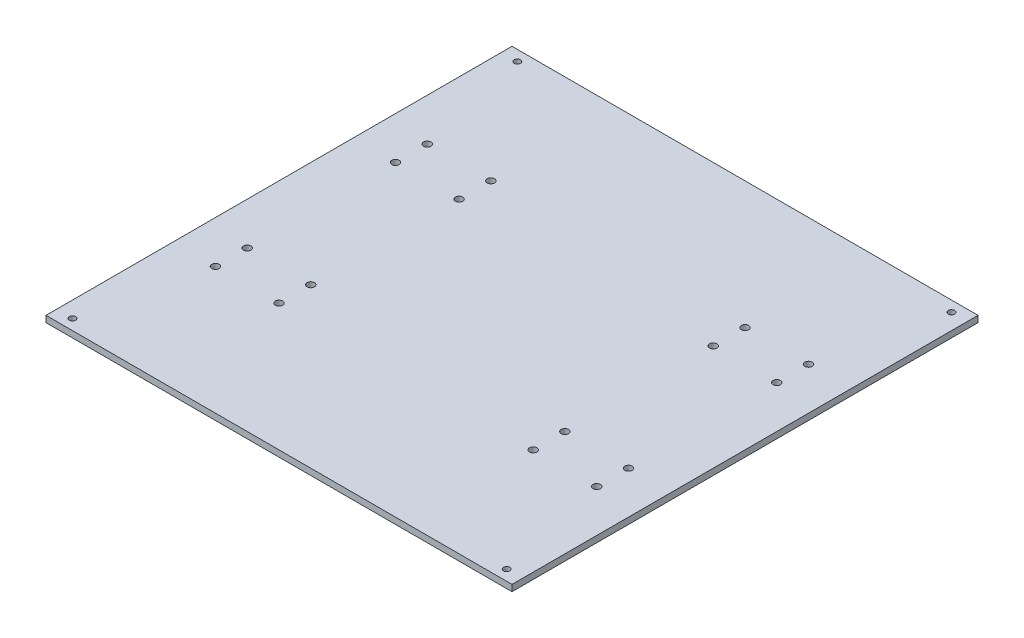
ISO-10303-21;
HEADER;
FILE_DESCRIPTION(('STEP AP214'),'2;1');
FILE_NAME('part.step','',(''),(''),'','','');
FILE_SCHEMA(('AUTOMOTIVE_DESIGN { 1 0 10303 214 1 1 1 1 }'));
ENDSEC;
DATA;
#1=APPLICATION_CONTEXT('core data for automotive mechanical design processes');
#2=APPLICATION_PROTOCOL_DEFINITION('international standard','automotive_design',2000,#1);
#3=PRODUCT_CONTEXT('',#1,'mechanical');
#4=PRODUCT('Part','Part','',(#3));
#5=PRODUCT_RELATED_PRODUCT_CATEGORY('part','',(#4));
#6=PRODUCT_DEFINITION_FORMATION('','',#4);
#7=PRODUCT_DEFINITION_CONTEXT('part definition',#1,'design');
#8=PRODUCT_DEFINITION('design','',#6,#7);
#9=PRODUCT_DEFINITION_SHAPE('','',#8);
#10=(LENGTH_UNIT() NAMED_UNIT(*) SI_UNIT(.MILLI.,.METRE.));
#11=(NAMED_UNIT(*) PLANE_ANGLE_UNIT() SI_UNIT($,.RADIAN.));
#12=(NAMED_UNIT(*) SI_UNIT($,.STERADIAN.) SOLID_ANGLE_UNIT());
#13=UNCERTAINTY_MEASURE_WITH_UNIT(LENGTH_MEASURE(1.E-05),#10,'distance_accuracy_value','');
#14=(GEOMETRIC_REPRESENTATION_CONTEXT(3) GLOBAL_UNCERTAINTY_ASSIGNED_CONTEXT((#13)) GLOBAL_UNIT_ASSIGNED_CONTEXT((#10,
#11,#12)) REPRESENTATION_CONTEXT('',''));
#15=CARTESIAN_POINT('',(0.,0.,0.));
#16=DIRECTION('',(0.,0.,1.));
#17=DIRECTION('',(1.,0.,0.));
#18=AXIS2_PLACEMENT_3D('',#15,#16,#17);
#19=CARTESIAN_POINT('',(0.,3.,0.));
#20=DIRECTION('',(0.,-1.,0.));
#21=DIRECTION('',(0.,0.,-1.));
#22=AXIS2_PLACEMENT_3D('',#19,#20,#21);
#23=PLANE('',#22);
#24=DIRECTION('',(0.,0.,-1.));
#25=VECTOR('',#24,1.);
#26=CARTESIAN_POINT('',(110.,3.,110.));
#27=LINE('',#26,#25);
#28=CARTESIAN_POINT('',(110.,3.,110.));
#29=VERTEX_POINT('',#28);
#30=CARTESIAN_POINT('',(110.,3.,-110.));
#31=VERTEX_POINT('',#30);
#32=EDGE_CURVE('E85',#29,#31,#27,.T.);
#33=ORIENTED_EDGE('',*,*,#32,.T.);
#34=DIRECTION('',(-1.,0.,0.));
#35=VECTOR('',#34,1.);
#36=CARTESIAN_POINT('',(-110.,3.,-110.));
#37=LINE('',#36,#35);
#38=CARTESIAN_POINT('',(-110.,3.,-110.));
#39=VERTEX_POINT('',#38);
#40=EDGE_CURVE('E80',#31,#39,#37,.T.);
#41=ORIENTED_EDGE('',*,*,#40,.T.);
#42=DIRECTION('',(0.,0.,1.));
#43=VECTOR('',#42,1.);
#44=CARTESIAN_POINT('',(-110.,3.,110.));
#45=LINE('',#44,#43);
#46=CARTESIAN_POINT('',(-110.,3.,110.));
#47=VERTEX_POINT('',#46);
#48=EDGE_CURVE('E83',#39,#47,#45,.T.);
#49=ORIENTED_EDGE('',*,*,#48,.T.);
#50=DIRECTION('',(1.,0.,0.));
#51=VECTOR('',#50,1.);
#52=CARTESIAN_POINT('',(-110.,3.,110.));
#53=LINE('',#52,#51);
#54=EDGE_CURVE('E50',#47,#29,#53,.T.);
#55=ORIENTED_EDGE('',*,*,#54,.T.);
#56=EDGE_LOOP('',(#33,#41,#49,#55));
#57=FACE_BOUND('',#56,.T.);
#58=CARTESIAN_POINT('',(-102.5,3.,-105.));
#59=DIRECTION('',(0.,1.,0.));
#60=DIRECTION('',(0.,0.,1.));
#61=AXIS2_PLACEMENT_3D('',#58,#59,#60);
#62=CIRCLE('',#61,1.5);
#63=CARTESIAN_POINT('',(-102.5,3.,-103.5));
#64=VERTEX_POINT('',#63);
#65=EDGE_CURVE('E100',#64,#64,#62,.T.);
#66=ORIENTED_EDGE('',*,*,#65,.F.);
#67=EDGE_LOOP('',(#66));
#68=FACE_BOUND('',#67,.T.);
#69=CARTESIAN_POINT('',(-102.5,3.,105.));
#70=DIRECTION('',(0.,1.,0.));
#71=DIRECTION('',(0.,0.,1.));
#72=AXIS2_PLACEMENT_3D('',#69,#70,#71);
#73=CIRCLE('',#72,1.5);
#74=CARTESIAN_POINT('',(-102.5,3.,106.5));
#75=VERTEX_POINT('',#74);
#76=EDGE_CURVE('E115',#75,#75,#73,.T.);
#77=ORIENTED_EDGE('',*,*,#76,.F.);
#78=EDGE_LOOP('',(#77));
#79=FACE_BOUND('',#78,.T.);
#80=CARTESIAN_POINT('',(102.5,3.,105.));
#81=DIRECTION('',(0.,1.,0.));
#82=DIRECTION('',(0.,0.,-1.));
#83=AXIS2_PLACEMENT_3D('',#80,#81,#82);
#84=CIRCLE('',#83,1.5);
#85=CARTESIAN_POINT('',(102.5,3.,103.5));
#86=VERTEX_POINT('',#85);
#87=EDGE_CURVE('E121',#86,#86,#84,.T.);
#88=ORIENTED_EDGE('',*,*,#87,.F.);
#89=EDGE_LOOP('',(#88));
#90=FACE_BOUND('',#89,.T.);
#91=CARTESIAN_POINT('',(102.5,3.,-105.));
#92=DIRECTION('',(0.,1.,0.));
#93=DIRECTION('',(0.,0.,-1.));
#94=AXIS2_PLACEMENT_3D('',#91,#92,#93);
#95=CIRCLE('',#94,1.5);
#96=CARTESIAN_POINT('',(102.5,3.,-106.5));
#97=VERTEX_POINT('',#96);
#98=EDGE_CURVE('E127',#97,#97,#95,.T.);
#99=ORIENTED_EDGE('',*,*,#98,.F.);
#100=EDGE_LOOP('',(#99));
#101=FACE_BOUND('',#100,.T.);
#102=CARTESIAN_POINT('',(-90.,3.,-50.));
#103=DIRECTION('',(0.,1.,0.));
#104=DIRECTION('',(0.,0.,1.));
#105=AXIS2_PLACEMENT_3D('',#102,#103,#104);
#106=CIRCLE('',#105,1.75);
#107=CARTESIAN_POINT('',(-90.,3.,-48.25));
#108=VERTEX_POINT('',#107);
#109=EDGE_CURVE('E133',#108,#108,#106,.T.);
#110=ORIENTED_EDGE('',*,*,#109,.F.);
#111=EDGE_LOOP('',(#110));
#112=FACE_BOUND('',#111,.T.);
#113=CARTESIAN_POINT('',(-59.9999999999999,3.,-35.));
#114=DIRECTION('',(0.,1.,0.));
#115=DIRECTION('',(0.,0.,1.));
#116=AXIS2_PLACEMENT_3D('',#113,#114,#115);
#117=CIRCLE('',#116,1.75);
#118=CARTESIAN_POINT('',(-59.9999999999999,3.,-33.25));
#119=VERTEX_POINT('',#118);
#120=EDGE_CURVE('E139',#119,#119,#117,.T.);
#121=ORIENTED_EDGE('',*,*,#120,.F.);
#122=EDGE_LOOP('',(#121));
#123=FACE_BOUND('',#122,.T.);
#124=CARTESIAN_POINT('',(-90.,3.,-35.));
#125=DIRECTION('',(0.,1.,0.));
#126=DIRECTION('',(0.,0.,1.));
#127=AXIS2_PLACEMENT_3D('',#124,#125,#126);
#128=CIRCLE('',#127,1.75);
#129=CARTESIAN_POINT('',(-90.,3.,-33.25));
#130=VERTEX_POINT('',#129);
#131=EDGE_CURVE('E145',#130,#130,#128,.T.);
#132=ORIENTED_EDGE('',*,*,#131,.F.);
#133=EDGE_LOOP('',(#132));
#134=FACE_BOUND('',#133,.T.);
#135=CARTESIAN_POINT('',(-60.,3.,-50.));
#136=DIRECTION('',(0.,1.,0.));
#137=DIRECTION('',(0.,0.,1.));
#138=AXIS2_PLACEMENT_3D('',#135,#136,#137);
#139=CIRCLE('',#138,1.75);
#140=CARTESIAN_POINT('',(-60.,3.,-48.25));
#141=VERTEX_POINT('',#140);
#142=EDGE_CURVE('E151',#141,#141,#139,.T.);
#143=ORIENTED_EDGE('',*,*,#142,.F.);
#144=EDGE_LOOP('',(#143));
#145=FACE_BOUND('',#144,.T.);
#146=CARTESIAN_POINT('',(60.,3.,-50.));
#147=DIRECTION('',(0.,1.,0.));
#148=DIRECTION('',(0.,0.,-1.));
#149=AXIS2_PLACEMENT_3D('',#146,#147,#148);
#150=CIRCLE('',#149,1.75);
#151=CARTESIAN_POINT('',(60.,3.,-51.75));
#152=VERTEX_POINT('',#151);
#153=EDGE_CURVE('E157',#152,#152,#150,.T.);
#154=ORIENTED_EDGE('',*,*,#153,.F.);
#155=EDGE_LOOP('',(#154));
#156=FACE_BOUND('',#155,.T.);
#157=CARTESIAN_POINT('',(90.0000000000001,3.,-35.));
#158=DIRECTION('',(0.,1.,0.));
#159=DIRECTION('',(0.,0.,-1.));
#160=AXIS2_PLACEMENT_3D('',#157,#158,#159);
#161=CIRCLE('',#160,1.75);
#162=CARTESIAN_POINT('',(90.0000000000001,3.,-36.75));
#163=VERTEX_POINT('',#162);
#164=EDGE_CURVE('E163',#163,#163,#161,.T.);
#165=ORIENTED_EDGE('',*,*,#164,.F.);
#166=EDGE_LOOP('',(#165));
#167=FACE_BOUND('',#166,.T.);
#168=CARTESIAN_POINT('',(59.9999999999999,3.,-35.));
#169=DIRECTION('',(0.,1.,0.));
#170=DIRECTION('',(0.,0.,-1.));
#171=AXIS2_PLACEMENT_3D('',#168,#169,#170);
#172=CIRCLE('',#171,1.75);
#173=CARTESIAN_POINT('',(59.9999999999999,3.,-36.75));
#174=VERTEX_POINT('',#173);
#175=EDGE_CURVE('E169',#174,#174,#172,.T.);
#176=ORIENTED_EDGE('',*,*,#175,.F.);
#177=EDGE_LOOP('',(#176));
#178=FACE_BOUND('',#177,.T.);
#179=CARTESIAN_POINT('',(90.,3.,-50.));
#180=DIRECTION('',(0.,1.,0.));
#181=DIRECTION('',(0.,0.,-1.));
#182=AXIS2_PLACEMENT_3D('',#179,#180,#181);
#183=CIRCLE('',#182,1.75);
#184=CARTESIAN_POINT('',(90.,3.,-51.75));
#185=VERTEX_POINT('',#184);
#186=EDGE_CURVE('E175',#185,#185,#183,.T.);
#187=ORIENTED_EDGE('',*,*,#186,.F.);
#188=EDGE_LOOP('',(#187));
#189=FACE_BOUND('',#188,.T.);
#190=CARTESIAN_POINT('',(90.,3.,50.));
#191=DIRECTION('',(0.,1.,0.));
#192=DIRECTION('',(0.,0.,1.));
#193=AXIS2_PLACEMENT_3D('',#190,#191,#192);
#194=CIRCLE('',#193,1.75);
#195=CARTESIAN_POINT('',(90.,3.,51.75));
#196=VERTEX_POINT('',#195);
#197=EDGE_CURVE('E181',#196,#196,#194,.T.);
#198=ORIENTED_EDGE('',*,*,#197,.F.);
#199=EDGE_LOOP('',(#198));
#200=FACE_BOUND('',#199,.T.);
#201=CARTESIAN_POINT('',(59.9999999999999,3.,35.));
#202=DIRECTION('',(0.,1.,0.));
#203=DIRECTION('',(0.,0.,1.));
#204=AXIS2_PLACEMENT_3D('',#201,#202,#203);
#205=CIRCLE('',#204,1.75);
#206=CARTESIAN_POINT('',(59.9999999999999,3.,36.75));
#207=VERTEX_POINT('',#206);
#208=EDGE_CURVE('E187',#207,#207,#205,.T.);
#209=ORIENTED_EDGE('',*,*,#208,.F.);
#210=EDGE_LOOP('',(#209));
#211=FACE_BOUND('',#210,.T.);
#212=CARTESIAN_POINT('',(90.0000000000001,3.,35.));
#213=DIRECTION('',(0.,1.,0.));
#214=DIRECTION('',(0.,0.,1.));
#215=AXIS2_PLACEMENT_3D('',#212,#213,#214);
#216=CIRCLE('',#215,1.75);
#217=CARTESIAN_POINT('',(90.0000000000001,3.,36.75));
#218=VERTEX_POINT('',#217);
#219=EDGE_CURVE('E193',#218,#218,#216,.T.);
#220=ORIENTED_EDGE('',*,*,#219,.F.);
#221=EDGE_LOOP('',(#220));
#222=FACE_BOUND('',#221,.T.);
#223=CARTESIAN_POINT('',(60.,3.,50.));
#224=DIRECTION('',(0.,1.,0.));
#225=DIRECTION('',(0.,0.,1.));
#226=AXIS2_PLACEMENT_3D('',#223,#224,#225);
#227=CIRCLE('',#226,1.75);
#228=CARTESIAN_POINT('',(60.,3.,51.75));
#229=VERTEX_POINT('',#228);
#230=EDGE_CURVE('E199',#229,#229,#227,.T.);
#231=ORIENTED_EDGE('',*,*,#230,.F.);
#232=EDGE_LOOP('',(#231));
#233=FACE_BOUND('',#232,.T.);
#234=CARTESIAN_POINT('',(-60.,3.,50.0000000000001));
#235=DIRECTION('',(0.,1.,0.));
#236=DIRECTION('',(0.,0.,-1.));
#237=AXIS2_PLACEMENT_3D('',#234,#235,#236);
#238=CIRCLE('',#237,1.75);
#239=CARTESIAN_POINT('',(-60.,3.,48.2500000000001));
#240=VERTEX_POINT('',#239);
#241=EDGE_CURVE('E205',#240,#240,#238,.T.);
#242=ORIENTED_EDGE('',*,*,#241,.F.);
#243=EDGE_LOOP('',(#242));
#244=FACE_BOUND('',#243,.T.);
#245=CARTESIAN_POINT('',(-90.,3.,35.0000000000001));
#246=DIRECTION('',(0.,1.,0.));
#247=DIRECTION('',(0.,0.,-1.));
#248=AXIS2_PLACEMENT_3D('',#245,#246,#247);
#249=CIRCLE('',#248,1.75);
#250=CARTESIAN_POINT('',(-90.,3.,33.2500000000001));
#251=VERTEX_POINT('',#250);
#252=EDGE_CURVE('E211',#251,#251,#249,.T.);
#253=ORIENTED_EDGE('',*,*,#252,.F.);
#254=EDGE_LOOP('',(#253));
#255=FACE_BOUND('',#254,.T.);
#256=CARTESIAN_POINT('',(-59.9999999999999,3.,35.));
#257=DIRECTION('',(0.,1.,0.));
#258=DIRECTION('',(0.,0.,-1.));
#259=AXIS2_PLACEMENT_3D('',#256,#257,#258);
#260=CIRCLE('',#259,1.75);
#261=CARTESIAN_POINT('',(-59.9999999999999,3.,33.25));
#262=VERTEX_POINT('',#261);
#263=EDGE_CURVE('E217',#262,#262,#260,.T.);
#264=ORIENTED_EDGE('',*,*,#263,.F.);
#265=EDGE_LOOP('',(#264));
#266=FACE_BOUND('',#265,.T.);
#267=CARTESIAN_POINT('',(-90.,3.,49.9999999999999));
#268=DIRECTION('',(0.,1.,0.));
#269=DIRECTION('',(0.,0.,-1.));
#270=AXIS2_PLACEMENT_3D('',#267,#268,#269);
#271=CIRCLE('',#270,1.75);
#272=CARTESIAN_POINT('',(-90.,3.,48.2499999999999));
#273=VERTEX_POINT('',#272);
#274=EDGE_CURVE('E223',#273,#273,#271,.T.);
#275=ORIENTED_EDGE('',*,*,#274,.F.);
#276=EDGE_LOOP('',(#275));
#277=FACE_BOUND('',#276,.T.);
#278=ADVANCED_FACE('F33',(#57,#68,#79,#90,#101,#112,#123,#134,#145,#156,#167,#178,#189,#200,
#211,#222,#233,#244,#255,#266,#277),#23,.F.);
#279=CARTESIAN_POINT('',(0.,0.,0.));
#280=DIRECTION('',(0.,-1.,0.));
#281=DIRECTION('',(0.,0.,-1.));
#282=AXIS2_PLACEMENT_3D('',#279,#280,#281);
#283=PLANE('',#282);
#284=CARTESIAN_POINT('',(-59.9999999999999,0.,35.));
#285=DIRECTION('',(0.,1.,0.));
#286=DIRECTION('',(0.,0.,-1.));
#287=AXIS2_PLACEMENT_3D('',#284,#285,#286);
#288=CIRCLE('',#287,1.75);
#289=CARTESIAN_POINT('',(-59.9999999999999,0.,33.25));
#290=VERTEX_POINT('',#289);
#291=EDGE_CURVE('E220',#290,#290,#288,.T.);
#292=ORIENTED_EDGE('',*,*,#291,.T.);
#293=EDGE_LOOP('',(#292));
#294=FACE_BOUND('',#293,.T.);
#295=CARTESIAN_POINT('',(-60.,0.,50.0000000000001));
#296=DIRECTION('',(0.,1.,0.));
#297=DIRECTION('',(0.,0.,-1.));
#298=AXIS2_PLACEMENT_3D('',#295,#296,#297);
#299=CIRCLE('',#298,1.75);
#300=CARTESIAN_POINT('',(-60.,0.,48.2500000000001));
#301=VERTEX_POINT('',#300);
#302=EDGE_CURVE('E208',#301,#301,#299,.T.);
#303=ORIENTED_EDGE('',*,*,#302,.T.);
#304=EDGE_LOOP('',(#303));
#305=FACE_BOUND('',#304,.T.);
#306=CARTESIAN_POINT('',(90.0000000000001,0.,35.));
#307=DIRECTION('',(0.,1.,0.));
#308=DIRECTION('',(0.,0.,1.));
#309=AXIS2_PLACEMENT_3D('',#306,#307,#308);
#310=CIRCLE('',#309,1.75);
#311=CARTESIAN_POINT('',(90.0000000000001,0.,36.75));
#312=VERTEX_POINT('',#311);
#313=EDGE_CURVE('E196',#312,#312,#310,.T.);
#314=ORIENTED_EDGE('',*,*,#313,.T.);
#315=EDGE_LOOP('',(#314));
#316=FACE_BOUND('',#315,.T.);
#317=CARTESIAN_POINT('',(90.,0.,50.));
#318=DIRECTION('',(0.,1.,0.));
#319=DIRECTION('',(0.,0.,1.));
#320=AXIS2_PLACEMENT_3D('',#317,#318,#319);
#321=CIRCLE('',#320,1.75);
#322=CARTESIAN_POINT('',(90.,0.,51.75));
#323=VERTEX_POINT('',#322);
#324=EDGE_CURVE('E184',#323,#323,#321,.T.);
#325=ORIENTED_EDGE('',*,*,#324,.T.);
#326=EDGE_LOOP('',(#325));
#327=FACE_BOUND('',#326,.T.);
#328=CARTESIAN_POINT('',(59.9999999999999,0.,-35.));
#329=DIRECTION('',(0.,1.,0.));
#330=DIRECTION('',(0.,0.,-1.));
#331=AXIS2_PLACEMENT_3D('',#328,#329,#330);
#332=CIRCLE('',#331,1.75);
#333=CARTESIAN_POINT('',(59.9999999999999,0.,-36.75));
#334=VERTEX_POINT('',#333);
#335=EDGE_CURVE('E172',#334,#334,#332,.T.);
#336=ORIENTED_EDGE('',*,*,#335,.T.);
#337=EDGE_LOOP('',(#336));
#338=FACE_BOUND('',#337,.T.);
#339=CARTESIAN_POINT('',(60.,0.,-50.));
#340=DIRECTION('',(0.,1.,0.));
#341=DIRECTION('',(0.,0.,-1.));
#342=AXIS2_PLACEMENT_3D('',#339,#340,#341);
#343=CIRCLE('',#342,1.75);
#344=CARTESIAN_POINT('',(60.,0.,-51.75));
#345=VERTEX_POINT('',#344);
#346=EDGE_CURVE('E160',#345,#345,#343,.T.);
#347=ORIENTED_EDGE('',*,*,#346,.T.);
#348=EDGE_LOOP('',(#347));
#349=FACE_BOUND('',#348,.T.);
#350=CARTESIAN_POINT('',(-90.,0.,-35.));
#351=DIRECTION('',(0.,1.,0.));
#352=DIRECTION('',(0.,0.,1.));
#353=AXIS2_PLACEMENT_3D('',#350,#351,#352);
#354=CIRCLE('',#353,1.75);
#355=CARTESIAN_POINT('',(-90.,0.,-33.25));
#356=VERTEX_POINT('',#355);
#357=EDGE_CURVE('E148',#356,#356,#354,.T.);
#358=ORIENTED_EDGE('',*,*,#357,.T.);
#359=EDGE_LOOP('',(#358));
#360=FACE_BOUND('',#359,.T.);
#361=CARTESIAN_POINT('',(-90.,0.,-50.));
#362=DIRECTION('',(0.,1.,0.));
#363=DIRECTION('',(0.,0.,1.));
#364=AXIS2_PLACEMENT_3D('',#361,#362,#363);
#365=CIRCLE('',#364,1.75);
#366=CARTESIAN_POINT('',(-90.,0.,-48.25));
#367=VERTEX_POINT('',#366);
#368=EDGE_CURVE('E136',#367,#367,#365,.T.);
#369=ORIENTED_EDGE('',*,*,#368,.T.);
#370=EDGE_LOOP('',(#369));
#371=FACE_BOUND('',#370,.T.);
#372=CARTESIAN_POINT('',(102.5,0.,105.));
#373=DIRECTION('',(0.,1.,0.));
#374=DIRECTION('',(0.,0.,-1.));
#375=AXIS2_PLACEMENT_3D('',#372,#373,#374);
#376=CIRCLE('',#375,1.5);
#377=CARTESIAN_POINT('',(102.5,0.,103.5));
#378=VERTEX_POINT('',#377);
#379=EDGE_CURVE('E124',#378,#378,#376,.T.);
#380=ORIENTED_EDGE('',*,*,#379,.T.);
#381=EDGE_LOOP('',(#380));
#382=FACE_BOUND('',#381,.T.);
#383=CARTESIAN_POINT('',(-102.5,0.,-105.));
#384=DIRECTION('',(0.,1.,0.));
#385=DIRECTION('',(0.,0.,1.));
#386=AXIS2_PLACEMENT_3D('',#383,#384,#385);
#387=CIRCLE('',#386,1.5);
#388=CARTESIAN_POINT('',(-102.5,0.,-103.5));
#389=VERTEX_POINT('',#388);
#390=EDGE_CURVE('E112',#389,#389,#387,.T.);
#391=ORIENTED_EDGE('',*,*,#390,.T.);
#392=EDGE_LOOP('',(#391));
#393=FACE_BOUND('',#392,.T.);
#394=DIRECTION('',(0.,0.,-1.));
#395=VECTOR('',#394,1.);
#396=CARTESIAN_POINT('',(110.,0.,110.));
#397=LINE('',#396,#395);
#398=CARTESIAN_POINT('',(110.,0.,110.));
#399=VERTEX_POINT('',#398);
#400=CARTESIAN_POINT('',(110.,0.,-110.));
#401=VERTEX_POINT('',#400);
#402=EDGE_CURVE('E97',#399,#401,#397,.T.);
#403=ORIENTED_EDGE('',*,*,#402,.F.);
#404=DIRECTION('',(1.,0.,0.));
#405=VECTOR('',#404,1.);
#406=CARTESIAN_POINT('',(-110.,0.,110.));
#407=LINE('',#406,#405);
#408=CARTESIAN_POINT('',(-110.,0.,110.));
#409=VERTEX_POINT('',#408);
#410=EDGE_CURVE('E73',#409,#399,#407,.T.);
#411=ORIENTED_EDGE('',*,*,#410,.F.);
#412=DIRECTION('',(0.,0.,1.));
#413=VECTOR('',#412,1.);
#414=CARTESIAN_POINT('',(-110.,0.,110.));
#415=LINE('',#414,#413);
#416=CARTESIAN_POINT('',(-110.,0.,-110.));
#417=VERTEX_POINT('',#416);
#418=EDGE_CURVE('E67',#417,#409,#415,.T.);
#419=ORIENTED_EDGE('',*,*,#418,.F.);
#420=DIRECTION('',(-1.,0.,0.));
#421=VECTOR('',#420,1.);
#422=CARTESIAN_POINT('',(-110.,0.,-110.));
#423=LINE('',#422,#421);
#424=EDGE_CURVE('E89',#401,#417,#423,.T.);
#425=ORIENTED_EDGE('',*,*,#424,.F.);
#426=EDGE_LOOP('',(#403,#411,#419,#425));
#427=FACE_BOUND('',#426,.T.);
#428=CARTESIAN_POINT('',(-102.5,0.,105.));
#429=DIRECTION('',(0.,1.,0.));
#430=DIRECTION('',(0.,0.,1.));
#431=AXIS2_PLACEMENT_3D('',#428,#429,#430);
#432=CIRCLE('',#431,1.5);
#433=CARTESIAN_POINT('',(-102.5,0.,106.5));
#434=VERTEX_POINT('',#433);
#435=EDGE_CURVE('E118',#434,#434,#432,.T.);
#436=ORIENTED_EDGE('',*,*,#435,.T.);
#437=EDGE_LOOP('',(#436));
#438=FACE_BOUND('',#437,.T.);
#439=CARTESIAN_POINT('',(102.5,0.,-105.));
#440=DIRECTION('',(0.,1.,0.));
#441=DIRECTION('',(0.,0.,-1.));
#442=AXIS2_PLACEMENT_3D('',#439,#440,#441);
#443=CIRCLE('',#442,1.5);
#444=CARTESIAN_POINT('',(102.5,0.,-106.5));
#445=VERTEX_POINT('',#444);
#446=EDGE_CURVE('E130',#445,#445,#443,.T.);
#447=ORIENTED_EDGE('',*,*,#446,.T.);
#448=EDGE_LOOP('',(#447));
#449=FACE_BOUND('',#448,.T.);
#450=CARTESIAN_POINT('',(-59.9999999999999,0.,-35.));
#451=DIRECTION('',(0.,1.,0.));
#452=DIRECTION('',(0.,0.,1.));
#453=AXIS2_PLACEMENT_3D('',#450,#451,#452);
#454=CIRCLE('',#453,1.75);
#455=CARTESIAN_POINT('',(-59.9999999999999,0.,-33.25));
#456=VERTEX_POINT('',#455);
#457=EDGE_CURVE('E142',#456,#456,#454,.T.);
#458=ORIENTED_EDGE('',*,*,#457,.T.);
#459=EDGE_LOOP('',(#458));
#460=FACE_BOUND('',#459,.T.);
#461=CARTESIAN_POINT('',(-60.,0.,-50.));
#462=DIRECTION('',(0.,1.,0.));
#463=DIRECTION('',(0.,0.,1.));
#464=AXIS2_PLACEMENT_3D('',#461,#462,#463);
#465=CIRCLE('',#464,1.75);
#466=CARTESIAN_POINT('',(-60.,0.,-48.25));
#467=VERTEX_POINT('',#466);
#468=EDGE_CURVE('E154',#467,#467,#465,.T.);
#469=ORIENTED_EDGE('',*,*,#468,.T.);
#470=EDGE_LOOP('',(#469));
#471=FACE_BOUND('',#470,.T.);
#472=CARTESIAN_POINT('',(90.0000000000001,0.,-35.));
#473=DIRECTION('',(0.,1.,0.));
#474=DIRECTION('',(0.,0.,-1.));
#475=AXIS2_PLACEMENT_3D('',#472,#473,#474);
#476=CIRCLE('',#475,1.75);
#477=CARTESIAN_POINT('',(90.0000000000001,0.,-36.75));
#478=VERTEX_POINT('',#477);
#479=EDGE_CURVE('E166',#478,#478,#476,.T.);
#480=ORIENTED_EDGE('',*,*,#479,.T.);
#481=EDGE_LOOP('',(#480));
#482=FACE_BOUND('',#481,.T.);
#483=CARTESIAN_POINT('',(90.,0.,-50.));
#484=DIRECTION('',(0.,1.,0.));
#485=DIRECTION('',(0.,0.,-1.));
#486=AXIS2_PLACEMENT_3D('',#483,#484,#485);
#487=CIRCLE('',#486,1.75);
#488=CARTESIAN_POINT('',(90.,0.,-51.75));
#489=VERTEX_POINT('',#488);
#490=EDGE_CURVE('E178',#489,#489,#487,.T.);
#491=ORIENTED_EDGE('',*,*,#490,.T.);
#492=EDGE_LOOP('',(#491));
#493=FACE_BOUND('',#492,.T.);
#494=CARTESIAN_POINT('',(59.9999999999999,0.,35.));
#495=DIRECTION('',(0.,1.,0.));
#496=DIRECTION('',(0.,0.,1.));
#497=AXIS2_PLACEMENT_3D('',#494,#495,#496);
#498=CIRCLE('',#497,1.75);
#499=CARTESIAN_POINT('',(59.9999999999999,0.,36.75));
#500=VERTEX_POINT('',#499);
#501=EDGE_CURVE('E190',#500,#500,#498,.T.);
#502=ORIENTED_EDGE('',*,*,#501,.T.);
#503=EDGE_LOOP('',(#502));
#504=FACE_BOUND('',#503,.T.);
#505=CARTESIAN_POINT('',(60.,0.,50.));
#506=DIRECTION('',(0.,1.,0.));
#507=DIRECTION('',(0.,0.,1.));
#508=AXIS2_PLACEMENT_3D('',#505,#506,#507);
#509=CIRCLE('',#508,1.75);
#510=CARTESIAN_POINT('',(60.,0.,51.75));
#511=VERTEX_POINT('',#510);
#512=EDGE_CURVE('E202',#511,#511,#509,.T.);
#513=ORIENTED_EDGE('',*,*,#512,.T.);
#514=EDGE_LOOP('',(#513));
#515=FACE_BOUND('',#514,.T.);
#516=CARTESIAN_POINT('',(-90.,0.,35.0000000000001));
#517=DIRECTION('',(0.,1.,0.));
#518=DIRECTION('',(0.,0.,-1.));
#519=AXIS2_PLACEMENT_3D('',#516,#517,#518);
#520=CIRCLE('',#519,1.75);
#521=CARTESIAN_POINT('',(-90.,0.,33.2500000000001));
#522=VERTEX_POINT('',#521);
#523=EDGE_CURVE('E214',#522,#522,#520,.T.);
#524=ORIENTED_EDGE('',*,*,#523,.T.);
#525=EDGE_LOOP('',(#524));
#526=FACE_BOUND('',#525,.T.);
#527=CARTESIAN_POINT('',(-90.,0.,49.9999999999999));
#528=DIRECTION('',(0.,1.,0.));
#529=DIRECTION('',(0.,0.,-1.));
#530=AXIS2_PLACEMENT_3D('',#527,#528,#529);
#531=CIRCLE('',#530,1.75);
#532=CARTESIAN_POINT('',(-90.,0.,48.2499999999999));
#533=VERTEX_POINT('',#532);
#534=EDGE_CURVE('E226',#533,#533,#531,.T.);
#535=ORIENTED_EDGE('',*,*,#534,.T.);
#536=EDGE_LOOP('',(#535));
#537=FACE_BOUND('',#536,.T.);
#538=ADVANCED_FACE('F108',(#294,#305,#316,#327,#338,#349,#360,#371,#382,#393,#427,#438,#449,
#460,#471,#482,#493,#504,#515,#526,#537),#283,.T.);
#539=CARTESIAN_POINT('',(110.,3.,110.));
#540=DIRECTION('',(-1.,0.,0.));
#541=DIRECTION('',(0.,0.,1.));
#542=AXIS2_PLACEMENT_3D('',#539,#540,#541);
#543=PLANE('',#542);
#544=ORIENTED_EDGE('',*,*,#402,.T.);
#545=DIRECTION('',(0.,-1.,0.));
#546=VECTOR('',#545,1.);
#547=CARTESIAN_POINT('',(110.,3.,-110.));
#548=LINE('',#547,#546);
#549=EDGE_CURVE('E11',#31,#401,#548,.T.);
#550=ORIENTED_EDGE('',*,*,#549,.F.);
#551=ORIENTED_EDGE('',*,*,#32,.F.);
#552=DIRECTION('',(0.,-1.,0.));
#553=VECTOR('',#552,1.);
#554=CARTESIAN_POINT('',(110.,3.,110.));
#555=LINE('',#554,#553);
#556=EDGE_CURVE('E93',#29,#399,#555,.T.);
#557=ORIENTED_EDGE('',*,*,#556,.T.);
#558=EDGE_LOOP('',(#544,#550,#551,#557));
#559=FACE_BOUND('',#558,.T.);
#560=ADVANCED_FACE('F35',(#559),#543,.F.);
#561=CARTESIAN_POINT('',(-110.,3.,-110.));
#562=DIRECTION('',(0.,0.,1.));
#563=DIRECTION('',(1.,0.,0.));
#564=AXIS2_PLACEMENT_3D('',#561,#562,#563);
#565=PLANE('',#564);
#566=ORIENTED_EDGE('',*,*,#424,.T.);
#567=DIRECTION('',(0.,-1.,0.));
#568=VECTOR('',#567,1.);
#569=CARTESIAN_POINT('',(-110.,3.,-110.));
#570=LINE('',#569,#568);
#571=EDGE_CURVE('E42',#39,#417,#570,.T.);
#572=ORIENTED_EDGE('',*,*,#571,.F.);
#573=ORIENTED_EDGE('',*,*,#40,.F.);
#574=ORIENTED_EDGE('',*,*,#549,.T.);
#575=EDGE_LOOP('',(#566,#572,#573,#574));
#576=FACE_BOUND('',#575,.T.);
#577=ADVANCED_FACE('F88',(#576),#565,.F.);
#578=CARTESIAN_POINT('',(-110.,3.,110.));
#579=DIRECTION('',(1.,0.,0.));
#580=DIRECTION('',(0.,0.,-1.));
#581=AXIS2_PLACEMENT_3D('',#578,#579,#580);
#582=PLANE('',#581);
#583=ORIENTED_EDGE('',*,*,#418,.T.);
#584=DIRECTION('',(0.,-1.,0.));
#585=VECTOR('',#584,1.);
#586=CARTESIAN_POINT('',(-110.,3.,110.));
#587=LINE('',#586,#585);
#588=EDGE_CURVE('E90',#47,#409,#587,.T.);
#589=ORIENTED_EDGE('',*,*,#588,.F.);
#590=ORIENTED_EDGE('',*,*,#48,.F.);
#591=ORIENTED_EDGE('',*,*,#571,.T.);
#592=EDGE_LOOP('',(#583,#589,#590,#591));
#593=FACE_BOUND('',#592,.T.);
#594=ADVANCED_FACE('F91',(#593),#582,.F.);
#595=CARTESIAN_POINT('',(-110.,3.,110.));
#596=DIRECTION('',(0.,0.,-1.));
#597=DIRECTION('',(-1.,0.,0.));
#598=AXIS2_PLACEMENT_3D('',#595,#596,#597);
#599=PLANE('',#598);
#600=ORIENTED_EDGE('',*,*,#410,.T.);
#601=ORIENTED_EDGE('',*,*,#556,.F.);
#602=ORIENTED_EDGE('',*,*,#54,.F.);
#603=ORIENTED_EDGE('',*,*,#588,.T.);
#604=EDGE_LOOP('',(#600,#601,#602,#603));
#605=FACE_BOUND('',#604,.T.);
#606=ADVANCED_FACE('F105',(#605),#599,.F.);
#607=CARTESIAN_POINT('',(-102.5,3.,-105.));
#608=DIRECTION('',(0.,-1.,0.));
#609=DIRECTION('',(0.,0.,-1.));
#610=AXIS2_PLACEMENT_3D('',#607,#608,#609);
#611=CYLINDRICAL_SURFACE('',#610,1.5);
#612=ORIENTED_EDGE('',*,*,#65,.T.);
#613=EDGE_LOOP('',(#612));
#614=FACE_BOUND('',#613,.T.);
#615=ORIENTED_EDGE('',*,*,#390,.F.);
#616=EDGE_LOOP('',(#615));
#617=FACE_BOUND('',#616,.T.);
#618=ADVANCED_FACE('F243',(#614,#617),#611,.F.);
#619=CARTESIAN_POINT('',(-102.5,3.,105.));
#620=DIRECTION('',(0.,-1.,0.));
#621=DIRECTION('',(0.,0.,-1.));
#622=AXIS2_PLACEMENT_3D('',#619,#620,#621);
#623=CYLINDRICAL_SURFACE('',#622,1.5);
#624=ORIENTED_EDGE('',*,*,#76,.T.);
#625=EDGE_LOOP('',(#624));
#626=FACE_BOUND('',#625,.T.);
#627=ORIENTED_EDGE('',*,*,#435,.F.);
#628=EDGE_LOOP('',(#627));
#629=FACE_BOUND('',#628,.T.);
#630=ADVANCED_FACE('F289',(#626,#629),#623,.F.);
#631=CARTESIAN_POINT('',(102.5,3.,105.));
#632=DIRECTION('',(0.,-1.,0.));
#633=DIRECTION('',(0.,0.,-1.));
#634=AXIS2_PLACEMENT_3D('',#631,#632,#633);
#635=CYLINDRICAL_SURFACE('',#634,1.5);
#636=ORIENTED_EDGE('',*,*,#87,.T.);
#637=EDGE_LOOP('',(#636));
#638=FACE_BOUND('',#637,.T.);
#639=ORIENTED_EDGE('',*,*,#379,.F.);
#640=EDGE_LOOP('',(#639));
#641=FACE_BOUND('',#640,.T.);
#642=ADVANCED_FACE('F297',(#638,#641),#635,.F.);
#643=CARTESIAN_POINT('',(102.5,3.,-105.));
#644=DIRECTION('',(0.,-1.,0.));
#645=DIRECTION('',(0.,0.,-1.));
#646=AXIS2_PLACEMENT_3D('',#643,#644,#645);
#647=CYLINDRICAL_SURFACE('',#646,1.5);
#648=ORIENTED_EDGE('',*,*,#98,.T.);
#649=EDGE_LOOP('',(#648));
#650=FACE_BOUND('',#649,.T.);
#651=ORIENTED_EDGE('',*,*,#446,.F.);
#652=EDGE_LOOP('',(#651));
#653=FACE_BOUND('',#652,.T.);
#654=ADVANCED_FACE('F305',(#650,#653),#647,.F.);
#655=CARTESIAN_POINT('',(-90.,3.,-50.));
#656=DIRECTION('',(0.,-1.,0.));
#657=DIRECTION('',(0.,0.,-1.));
#658=AXIS2_PLACEMENT_3D('',#655,#656,#657);
#659=CYLINDRICAL_SURFACE('',#658,1.75);
#660=ORIENTED_EDGE('',*,*,#109,.T.);
#661=EDGE_LOOP('',(#660));
#662=FACE_BOUND('',#661,.T.);
#663=ORIENTED_EDGE('',*,*,#368,.F.);
#664=EDGE_LOOP('',(#663));
#665=FACE_BOUND('',#664,.T.);
#666=ADVANCED_FACE('F314',(#662,#665),#659,.F.);
#667=CARTESIAN_POINT('',(-59.9999999999999,3.,-35.));
#668=DIRECTION('',(0.,-1.,0.));
#669=DIRECTION('',(0.,0.,-1.));
#670=AXIS2_PLACEMENT_3D('',#667,#668,#669);
#671=CYLINDRICAL_SURFACE('',#670,1.75);
#672=ORIENTED_EDGE('',*,*,#120,.T.);
#673=EDGE_LOOP('',(#672));
#674=FACE_BOUND('',#673,.T.);
#675=ORIENTED_EDGE('',*,*,#457,.F.);
#676=EDGE_LOOP('',(#675));
#677=FACE_BOUND('',#676,.T.);
#678=ADVANCED_FACE('F323',(#674,#677),#671,.F.);
#679=CARTESIAN_POINT('',(-90.,3.,-35.));
#680=DIRECTION('',(0.,-1.,0.));
#681=DIRECTION('',(0.,0.,-1.));
#682=AXIS2_PLACEMENT_3D('',#679,#680,#681);
#683=CYLINDRICAL_SURFACE('',#682,1.75);
#684=ORIENTED_EDGE('',*,*,#131,.T.);
#685=EDGE_LOOP('',(#684));
#686=FACE_BOUND('',#685,.T.);
#687=ORIENTED_EDGE('',*,*,#357,.F.);
#688=EDGE_LOOP('',(#687));
#689=FACE_BOUND('',#688,.T.);
#690=ADVANCED_FACE('F332',(#686,#689),#683,.F.);
#691=CARTESIAN_POINT('',(-60.,3.,-50.));
#692=DIRECTION('',(0.,-1.,0.));
#693=DIRECTION('',(0.,0.,-1.));
#694=AXIS2_PLACEMENT_3D('',#691,#692,#693);
#695=CYLINDRICAL_SURFACE('',#694,1.75);
#696=ORIENTED_EDGE('',*,*,#142,.T.);
#697=EDGE_LOOP('',(#696));
#698=FACE_BOUND('',#697,.T.);
#699=ORIENTED_EDGE('',*,*,#468,.F.);
#700=EDGE_LOOP('',(#699));
#701=FACE_BOUND('',#700,.T.);
#702=ADVANCED_FACE('F341',(#698,#701),#695,.F.);
#703=CARTESIAN_POINT('',(60.,3.,-50.));
#704=DIRECTION('',(0.,-1.,0.));
#705=DIRECTION('',(0.,0.,-1.));
#706=AXIS2_PLACEMENT_3D('',#703,#704,#705);
#707=CYLINDRICAL_SURFACE('',#706,1.75);
#708=ORIENTED_EDGE('',*,*,#153,.T.);
#709=EDGE_LOOP('',(#708));
#710=FACE_BOUND('',#709,.T.);
#711=ORIENTED_EDGE('',*,*,#346,.F.);
#712=EDGE_LOOP('',(#711));
#713=FACE_BOUND('',#712,.T.);
#714=ADVANCED_FACE('F350',(#710,#713),#707,.F.);
#715=CARTESIAN_POINT('',(90.0000000000001,3.,-35.));
#716=DIRECTION('',(0.,-1.,0.));
#717=DIRECTION('',(0.,0.,-1.));
#718=AXIS2_PLACEMENT_3D('',#715,#716,#717);
#719=CYLINDRICAL_SURFACE('',#718,1.75);
#720=ORIENTED_EDGE('',*,*,#164,.T.);
#721=EDGE_LOOP('',(#720));
#722=FACE_BOUND('',#721,.T.);
#723=ORIENTED_EDGE('',*,*,#479,.F.);
#724=EDGE_LOOP('',(#723));
#725=FACE_BOUND('',#724,.T.);
#726=ADVANCED_FACE('F359',(#722,#725),#719,.F.);
#727=CARTESIAN_POINT('',(59.9999999999999,3.,-35.));
#728=DIRECTION('',(0.,-1.,0.));
#729=DIRECTION('',(0.,0.,-1.));
#730=AXIS2_PLACEMENT_3D('',#727,#728,#729);
#731=CYLINDRICAL_SURFACE('',#730,1.75);
#732=ORIENTED_EDGE('',*,*,#175,.T.);
#733=EDGE_LOOP('',(#732));
#734=FACE_BOUND('',#733,.T.);
#735=ORIENTED_EDGE('',*,*,#335,.F.);
#736=EDGE_LOOP('',(#735));
#737=FACE_BOUND('',#736,.T.);
#738=ADVANCED_FACE('F368',(#734,#737),#731,.F.);
#739=CARTESIAN_POINT('',(90.,3.,-50.));
#740=DIRECTION('',(0.,-1.,0.));
#741=DIRECTION('',(0.,0.,-1.));
#742=AXIS2_PLACEMENT_3D('',#739,#740,#741);
#743=CYLINDRICAL_SURFACE('',#742,1.75);
#744=ORIENTED_EDGE('',*,*,#186,.T.);
#745=EDGE_LOOP('',(#744));
#746=FACE_BOUND('',#745,.T.);
#747=ORIENTED_EDGE('',*,*,#490,.F.);
#748=EDGE_LOOP('',(#747));
#749=FACE_BOUND('',#748,.T.);
#750=ADVANCED_FACE('F377',(#746,#749),#743,.F.);
#751=CARTESIAN_POINT('',(90.,3.,50.));
#752=DIRECTION('',(0.,-1.,0.));
#753=DIRECTION('',(0.,0.,-1.));
#754=AXIS2_PLACEMENT_3D('',#751,#752,#753);
#755=CYLINDRICAL_SURFACE('',#754,1.75);
#756=ORIENTED_EDGE('',*,*,#197,.T.);
#757=EDGE_LOOP('',(#756));
#758=FACE_BOUND('',#757,.T.);
#759=ORIENTED_EDGE('',*,*,#324,.F.);
#760=EDGE_LOOP('',(#759));
#761=FACE_BOUND('',#760,.T.);
#762=ADVANCED_FACE('F386',(#758,#761),#755,.F.);
#763=CARTESIAN_POINT('',(59.9999999999999,3.,35.));
#764=DIRECTION('',(0.,-1.,0.));
#765=DIRECTION('',(0.,0.,-1.));
#766=AXIS2_PLACEMENT_3D('',#763,#764,#765);
#767=CYLINDRICAL_SURFACE('',#766,1.75);
#768=ORIENTED_EDGE('',*,*,#208,.T.);
#769=EDGE_LOOP('',(#768));
#770=FACE_BOUND('',#769,.T.);
#771=ORIENTED_EDGE('',*,*,#501,.F.);
#772=EDGE_LOOP('',(#771));
#773=FACE_BOUND('',#772,.T.);
#774=ADVANCED_FACE('F395',(#770,#773),#767,.F.);
#775=CARTESIAN_POINT('',(90.0000000000001,3.,35.));
#776=DIRECTION('',(0.,-1.,0.));
#777=DIRECTION('',(0.,0.,-1.));
#778=AXIS2_PLACEMENT_3D('',#775,#776,#777);
#779=CYLINDRICAL_SURFACE('',#778,1.75);
#780=ORIENTED_EDGE('',*,*,#219,.T.);
#781=EDGE_LOOP('',(#780));
#782=FACE_BOUND('',#781,.T.);
#783=ORIENTED_EDGE('',*,*,#313,.F.);
#784=EDGE_LOOP('',(#783));
#785=FACE_BOUND('',#784,.T.);
#786=ADVANCED_FACE('F404',(#782,#785),#779,.F.);
#787=CARTESIAN_POINT('',(60.,3.,50.));
#788=DIRECTION('',(0.,-1.,0.));
#789=DIRECTION('',(0.,0.,-1.));
#790=AXIS2_PLACEMENT_3D('',#787,#788,#789);
#791=CYLINDRICAL_SURFACE('',#790,1.75);
#792=ORIENTED_EDGE('',*,*,#230,.T.);
#793=EDGE_LOOP('',(#792));
#794=FACE_BOUND('',#793,.T.);
#795=ORIENTED_EDGE('',*,*,#512,.F.);
#796=EDGE_LOOP('',(#795));
#797=FACE_BOUND('',#796,.T.);
#798=ADVANCED_FACE('F413',(#794,#797),#791,.F.);
#799=CARTESIAN_POINT('',(-60.,3.,50.0000000000001));
#800=DIRECTION('',(0.,-1.,0.));
#801=DIRECTION('',(0.,0.,-1.));
#802=AXIS2_PLACEMENT_3D('',#799,#800,#801);
#803=CYLINDRICAL_SURFACE('',#802,1.75);
#804=ORIENTED_EDGE('',*,*,#241,.T.);
#805=EDGE_LOOP('',(#804));
#806=FACE_BOUND('',#805,.T.);
#807=ORIENTED_EDGE('',*,*,#302,.F.);
#808=EDGE_LOOP('',(#807));
#809=FACE_BOUND('',#808,.T.);
#810=ADVANCED_FACE('F422',(#806,#809),#803,.F.);
#811=CARTESIAN_POINT('',(-90.,3.,35.0000000000001));
#812=DIRECTION('',(0.,-1.,0.));
#813=DIRECTION('',(0.,0.,-1.));
#814=AXIS2_PLACEMENT_3D('',#811,#812,#813);
#815=CYLINDRICAL_SURFACE('',#814,1.75);
#816=ORIENTED_EDGE('',*,*,#252,.T.);
#817=EDGE_LOOP('',(#816));
#818=FACE_BOUND('',#817,.T.);
#819=ORIENTED_EDGE('',*,*,#523,.F.);
#820=EDGE_LOOP('',(#819));
#821=FACE_BOUND('',#820,.T.);
#822=ADVANCED_FACE('F431',(#818,#821),#815,.F.);
#823=CARTESIAN_POINT('',(-59.9999999999999,3.,35.));
#824=DIRECTION('',(0.,-1.,0.));
#825=DIRECTION('',(0.,0.,-1.));
#826=AXIS2_PLACEMENT_3D('',#823,#824,#825);
#827=CYLINDRICAL_SURFACE('',#826,1.75);
#828=ORIENTED_EDGE('',*,*,#263,.T.);
#829=EDGE_LOOP('',(#828));
#830=FACE_BOUND('',#829,.T.);
#831=ORIENTED_EDGE('',*,*,#291,.F.);
#832=EDGE_LOOP('',(#831));
#833=FACE_BOUND('',#832,.T.);
#834=ADVANCED_FACE('F440',(#830,#833),#827,.F.);
#835=CARTESIAN_POINT('',(-90.,3.,49.9999999999999));
#836=DIRECTION('',(0.,-1.,0.));
#837=DIRECTION('',(0.,0.,-1.));
#838=AXIS2_PLACEMENT_3D('',#835,#836,#837);
#839=CYLINDRICAL_SURFACE('',#838,1.75);
#840=ORIENTED_EDGE('',*,*,#274,.T.);
#841=EDGE_LOOP('',(#840));
#842=FACE_BOUND('',#841,.T.);
#843=ORIENTED_EDGE('',*,*,#534,.F.);
#844=EDGE_LOOP('',(#843));
#845=FACE_BOUND('',#844,.T.);
#846=ADVANCED_FACE('F232',(#842,#845),#839,.F.);
#847=CLOSED_SHELL('',(#278,#538,#560,#577,#594,#606,#618,#630,#642,#654,#666,#678,#690,#702,
#714,#726,#738,#750,#762,#774,#786,#798,#810,#822,#834,#846));
#848=MANIFOLD_SOLID_BREP('B2',#847);
#849=ADVANCED_BREP_SHAPE_REPRESENTATION('',(#18,#848),#14);
#850=SHAPE_DEFINITION_REPRESENTATION(#9,#849);
ENDSEC;
END-ISO-10303-21;
